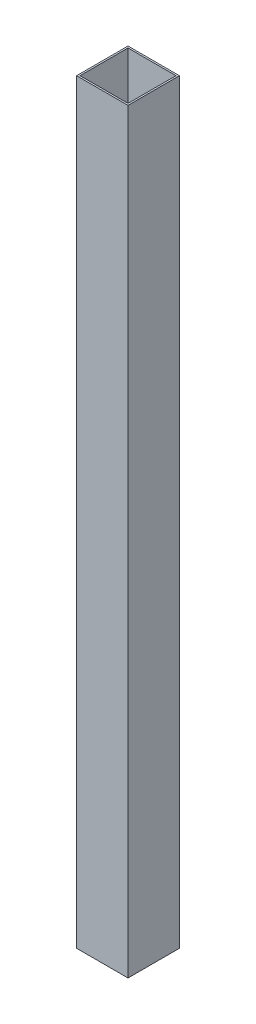
ISO-10303-21;
HEADER;
FILE_DESCRIPTION(('STEP AP214'),'2;1');
FILE_NAME('part.step','',(''),(''),'','','');
FILE_SCHEMA(('AUTOMOTIVE_DESIGN { 1 0 10303 214 1 1 1 1 }'));
ENDSEC;
DATA;
#1=APPLICATION_CONTEXT('core data for automotive mechanical design processes');
#2=APPLICATION_PROTOCOL_DEFINITION('international standard','automotive_design',2000,#1);
#3=PRODUCT_CONTEXT('',#1,'mechanical');
#4=PRODUCT('Part','Part','',(#3));
#5=PRODUCT_RELATED_PRODUCT_CATEGORY('part','',(#4));
#6=PRODUCT_DEFINITION_FORMATION('','',#4);
#7=PRODUCT_DEFINITION_CONTEXT('part definition',#1,'design');
#8=PRODUCT_DEFINITION('design','',#6,#7);
#9=PRODUCT_DEFINITION_SHAPE('','',#8);
#10=(LENGTH_UNIT() NAMED_UNIT(*) SI_UNIT(.MILLI.,.METRE.));
#11=(NAMED_UNIT(*) PLANE_ANGLE_UNIT() SI_UNIT($,.RADIAN.));
#12=(NAMED_UNIT(*) SI_UNIT($,.STERADIAN.) SOLID_ANGLE_UNIT());
#13=UNCERTAINTY_MEASURE_WITH_UNIT(LENGTH_MEASURE(1.E-05),#10,'distance_accuracy_value','');
#14=(GEOMETRIC_REPRESENTATION_CONTEXT(3) GLOBAL_UNCERTAINTY_ASSIGNED_CONTEXT((#13)) GLOBAL_UNIT_ASSIGNED_CONTEXT((#10,
#11,#12)) REPRESENTATION_CONTEXT('',''));
#15=CARTESIAN_POINT('',(0.,0.,0.));
#16=DIRECTION('',(0.,0.,1.));
#17=DIRECTION('',(1.,0.,0.));
#18=AXIS2_PLACEMENT_3D('',#15,#16,#17);
#19=CARTESIAN_POINT('',(-1002.,500.000000000001,440.));
#20=DIRECTION('',(1.,0.,0.));
#21=DIRECTION('',(0.,0.,-1.));
#22=AXIS2_PLACEMENT_3D('',#19,#20,#21);
#23=PLANE('',#22);
#24=DIRECTION('',(0.,-1.,0.));
#25=VECTOR('',#24,1.);
#26=CARTESIAN_POINT('',(-1002.,500.000000000001,500.));
#27=LINE('',#26,#25);
#28=CARTESIAN_POINT('',(-1002.,440.000000000001,500.));
#29=VERTEX_POINT('',#28);
#30=CARTESIAN_POINT('',(-1002.,-441.999999999999,500.));
#31=VERTEX_POINT('',#30);
#32=EDGE_CURVE('E162',#29,#31,#27,.T.);
#33=ORIENTED_EDGE('',*,*,#32,.F.);
#34=DIRECTION('',(0.,0.,-1.));
#35=VECTOR('',#34,1.);
#36=CARTESIAN_POINT('',(-1002.,440.000000000001,440.));
#37=LINE('',#36,#35);
#38=CARTESIAN_POINT('',(-1002.,440.000000000001,440.));
#39=VERTEX_POINT('',#38);
#40=EDGE_CURVE('E111',#29,#39,#37,.T.);
#41=ORIENTED_EDGE('',*,*,#40,.T.);
#42=DIRECTION('',(0.,-1.,0.));
#43=VECTOR('',#42,1.);
#44=CARTESIAN_POINT('',(-1002.,500.000000000001,440.));
#45=LINE('',#44,#43);
#46=CARTESIAN_POINT('',(-1002.,-441.999999999999,440.));
#47=VERTEX_POINT('',#46);
#48=EDGE_CURVE('E37',#39,#47,#45,.T.);
#49=ORIENTED_EDGE('',*,*,#48,.T.);
#50=DIRECTION('',(0.,0.,1.));
#51=VECTOR('',#50,1.);
#52=CARTESIAN_POINT('',(-1002.,-441.999999999999,440.));
#53=LINE('',#52,#51);
#54=EDGE_CURVE('E171',#47,#31,#53,.T.);
#55=ORIENTED_EDGE('',*,*,#54,.T.);
#56=EDGE_LOOP('',(#33,#41,#49,#55));
#57=FACE_BOUND('',#56,.T.);
#58=ADVANCED_FACE('F19',(#57),#23,.F.);
#59=CARTESIAN_POINT('',(-941.999999999999,500.000000000001,500.));
#60=DIRECTION('',(0.,0.,-1.));
#61=DIRECTION('',(-1.,0.,0.));
#62=AXIS2_PLACEMENT_3D('',#59,#60,#61);
#63=PLANE('',#62);
#64=DIRECTION('',(0.,-1.,0.));
#65=VECTOR('',#64,1.);
#66=CARTESIAN_POINT('',(-941.999999999999,500.000000000001,500.));
#67=LINE('',#66,#65);
#68=CARTESIAN_POINT('',(-941.999999999999,440.000000000001,500.));
#69=VERTEX_POINT('',#68);
#70=CARTESIAN_POINT('',(-942.,-441.999999999999,500.));
#71=VERTEX_POINT('',#70);
#72=EDGE_CURVE('E91',#69,#71,#67,.T.);
#73=ORIENTED_EDGE('',*,*,#72,.F.);
#74=DIRECTION('',(-1.,0.,0.));
#75=VECTOR('',#74,1.);
#76=CARTESIAN_POINT('',(-941.999999999999,440.000000000001,500.));
#77=LINE('',#76,#75);
#78=EDGE_CURVE('E94',#69,#29,#77,.T.);
#79=ORIENTED_EDGE('',*,*,#78,.T.);
#80=ORIENTED_EDGE('',*,*,#32,.T.);
#81=DIRECTION('',(1.,0.,0.));
#82=VECTOR('',#81,1.);
#83=CARTESIAN_POINT('',(-942.,-441.999999999999,500.));
#84=LINE('',#83,#82);
#85=EDGE_CURVE('E96',#31,#71,#84,.T.);
#86=ORIENTED_EDGE('',*,*,#85,.T.);
#87=EDGE_LOOP('',(#73,#79,#80,#86));
#88=FACE_BOUND('',#87,.T.);
#89=ADVANCED_FACE('F93',(#88),#63,.F.);
#90=CARTESIAN_POINT('',(-941.999999999999,500.000000000001,440.000000000001));
#91=DIRECTION('',(-1.,0.,0.));
#92=DIRECTION('',(0.,0.,1.));
#93=AXIS2_PLACEMENT_3D('',#90,#91,#92);
#94=PLANE('',#93);
#95=DIRECTION('',(0.,-1.,0.));
#96=VECTOR('',#95,1.);
#97=CARTESIAN_POINT('',(-941.999999999999,500.000000000001,440.000000000001));
#98=LINE('',#97,#96);
#99=CARTESIAN_POINT('',(-941.999999999999,440.000000000001,440.000000000002));
#100=VERTEX_POINT('',#99);
#101=CARTESIAN_POINT('',(-941.999999999998,-441.999999999999,440.));
#102=VERTEX_POINT('',#101);
#103=EDGE_CURVE('E115',#100,#102,#98,.T.);
#104=ORIENTED_EDGE('',*,*,#103,.F.);
#105=DIRECTION('',(0.,0.,1.));
#106=VECTOR('',#105,1.);
#107=CARTESIAN_POINT('',(-941.999999999999,440.000000000001,440.000000000002));
#108=LINE('',#107,#106);
#109=EDGE_CURVE('E109',#100,#69,#108,.T.);
#110=ORIENTED_EDGE('',*,*,#109,.T.);
#111=ORIENTED_EDGE('',*,*,#72,.T.);
#112=DIRECTION('',(0.,0.,-1.));
#113=VECTOR('',#112,1.);
#114=CARTESIAN_POINT('',(-941.999999999998,-441.999999999999,440.));
#115=LINE('',#114,#113);
#116=EDGE_CURVE('E102',#71,#102,#115,.T.);
#117=ORIENTED_EDGE('',*,*,#116,.T.);
#118=EDGE_LOOP('',(#104,#110,#111,#117));
#119=FACE_BOUND('',#118,.T.);
#120=ADVANCED_FACE('F114',(#119),#94,.F.);
#121=CARTESIAN_POINT('',(-941.999999999999,500.000000000001,440.000000000001));
#122=DIRECTION('',(0.,0.,1.));
#123=DIRECTION('',(1.,0.,0.));
#124=AXIS2_PLACEMENT_3D('',#121,#122,#123);
#125=PLANE('',#124);
#126=ORIENTED_EDGE('',*,*,#48,.F.);
#127=DIRECTION('',(1.,0.,0.));
#128=VECTOR('',#127,1.);
#129=CARTESIAN_POINT('',(-941.999999999999,440.000000000001,440.000000000002));
#130=LINE('',#129,#128);
#131=EDGE_CURVE('E117',#39,#100,#130,.T.);
#132=ORIENTED_EDGE('',*,*,#131,.T.);
#133=ORIENTED_EDGE('',*,*,#103,.T.);
#134=DIRECTION('',(-1.,0.,0.));
#135=VECTOR('',#134,1.);
#136=CARTESIAN_POINT('',(-941.999999999998,-441.999999999999,440.));
#137=LINE('',#136,#135);
#138=EDGE_CURVE('E158',#102,#47,#137,.T.);
#139=ORIENTED_EDGE('',*,*,#138,.T.);
#140=EDGE_LOOP('',(#126,#132,#133,#139));
#141=FACE_BOUND('',#140,.T.);
#142=ADVANCED_FACE('F210',(#141),#125,.F.);
#143=CARTESIAN_POINT('',(-999.999999999999,500.000000000001,442.));
#144=DIRECTION('',(1.,0.,0.));
#145=DIRECTION('',(0.,0.,-1.));
#146=AXIS2_PLACEMENT_3D('',#143,#144,#145);
#147=PLANE('',#146);
#148=DIRECTION('',(0.,-1.,0.));
#149=VECTOR('',#148,1.);
#150=CARTESIAN_POINT('',(-999.999999999999,500.000000000001,442.));
#151=LINE('',#150,#149);
#152=CARTESIAN_POINT('',(-999.999999999999,440.000000000001,442.));
#153=VERTEX_POINT('',#152);
#154=CARTESIAN_POINT('',(-1000.,-441.999999999999,442.));
#155=VERTEX_POINT('',#154);
#156=EDGE_CURVE('E202',#153,#155,#151,.T.);
#157=ORIENTED_EDGE('',*,*,#156,.F.);
#158=DIRECTION('',(0.,0.,-1.));
#159=VECTOR('',#158,1.);
#160=CARTESIAN_POINT('',(-999.999999999999,440.000000000001,442.));
#161=LINE('',#160,#159);
#162=CARTESIAN_POINT('',(-999.999999999999,440.000000000001,498.));
#163=VERTEX_POINT('',#162);
#164=EDGE_CURVE('E126',#163,#153,#161,.T.);
#165=ORIENTED_EDGE('',*,*,#164,.F.);
#166=DIRECTION('',(0.,-1.,0.));
#167=VECTOR('',#166,1.);
#168=CARTESIAN_POINT('',(-999.999999999999,500.000000000001,498.));
#169=LINE('',#168,#167);
#170=CARTESIAN_POINT('',(-1000.,-441.999999999999,498.));
#171=VERTEX_POINT('',#170);
#172=EDGE_CURVE('E159',#163,#171,#169,.T.);
#173=ORIENTED_EDGE('',*,*,#172,.T.);
#174=DIRECTION('',(0.,0.,1.));
#175=VECTOR('',#174,1.);
#176=CARTESIAN_POINT('',(-1000.,-441.999999999999,442.));
#177=LINE('',#176,#175);
#178=EDGE_CURVE('E143',#155,#171,#177,.T.);
#179=ORIENTED_EDGE('',*,*,#178,.F.);
#180=EDGE_LOOP('',(#157,#165,#173,#179));
#181=FACE_BOUND('',#180,.T.);
#182=ADVANCED_FACE('F208',(#181),#147,.T.);
#183=CARTESIAN_POINT('',(-943.999999999999,500.000000000001,442.));
#184=DIRECTION('',(0.,0.,1.));
#185=DIRECTION('',(1.,0.,0.));
#186=AXIS2_PLACEMENT_3D('',#183,#184,#185);
#187=PLANE('',#186);
#188=DIRECTION('',(0.,-1.,0.));
#189=VECTOR('',#188,1.);
#190=CARTESIAN_POINT('',(-943.999999999999,500.000000000001,442.));
#191=LINE('',#190,#189);
#192=CARTESIAN_POINT('',(-943.999999999999,440.000000000001,442.));
#193=VERTEX_POINT('',#192);
#194=CARTESIAN_POINT('',(-944.,-441.999999999999,442.));
#195=VERTEX_POINT('',#194);
#196=EDGE_CURVE('E148',#193,#195,#191,.T.);
#197=ORIENTED_EDGE('',*,*,#196,.F.);
#198=DIRECTION('',(1.,0.,0.));
#199=VECTOR('',#198,1.);
#200=CARTESIAN_POINT('',(-943.999999999999,440.000000000001,442.));
#201=LINE('',#200,#199);
#202=EDGE_CURVE('E130',#153,#193,#201,.T.);
#203=ORIENTED_EDGE('',*,*,#202,.F.);
#204=ORIENTED_EDGE('',*,*,#156,.T.);
#205=DIRECTION('',(-1.,0.,0.));
#206=VECTOR('',#205,1.);
#207=CARTESIAN_POINT('',(-944.,-441.999999999999,442.));
#208=LINE('',#207,#206);
#209=EDGE_CURVE('E12',#195,#155,#208,.T.);
#210=ORIENTED_EDGE('',*,*,#209,.F.);
#211=EDGE_LOOP('',(#197,#203,#204,#210));
#212=FACE_BOUND('',#211,.T.);
#213=ADVANCED_FACE('F201',(#212),#187,.T.);
#214=CARTESIAN_POINT('',(-943.999999999999,500.000000000001,442.));
#215=DIRECTION('',(-1.,0.,0.));
#216=DIRECTION('',(0.,0.,1.));
#217=AXIS2_PLACEMENT_3D('',#214,#215,#216);
#218=PLANE('',#217);
#219=DIRECTION('',(0.,-1.,0.));
#220=VECTOR('',#219,1.);
#221=CARTESIAN_POINT('',(-943.999999999999,500.000000000001,498.));
#222=LINE('',#221,#220);
#223=CARTESIAN_POINT('',(-943.999999999999,440.000000000001,498.000000000002));
#224=VERTEX_POINT('',#223);
#225=CARTESIAN_POINT('',(-944.,-441.999999999999,498.));
#226=VERTEX_POINT('',#225);
#227=EDGE_CURVE('E144',#224,#226,#222,.T.);
#228=ORIENTED_EDGE('',*,*,#227,.F.);
#229=DIRECTION('',(0.,0.,1.));
#230=VECTOR('',#229,1.);
#231=CARTESIAN_POINT('',(-943.999999999999,440.000000000001,442.));
#232=LINE('',#231,#230);
#233=EDGE_CURVE('E134',#193,#224,#232,.T.);
#234=ORIENTED_EDGE('',*,*,#233,.F.);
#235=ORIENTED_EDGE('',*,*,#196,.T.);
#236=DIRECTION('',(0.,0.,-1.));
#237=VECTOR('',#236,1.);
#238=CARTESIAN_POINT('',(-944.,-441.999999999999,442.));
#239=LINE('',#238,#237);
#240=EDGE_CURVE('E24',#226,#195,#239,.T.);
#241=ORIENTED_EDGE('',*,*,#240,.F.);
#242=EDGE_LOOP('',(#228,#234,#235,#241));
#243=FACE_BOUND('',#242,.T.);
#244=ADVANCED_FACE('F196',(#243),#218,.T.);
#245=CARTESIAN_POINT('',(-943.999999999999,500.000000000001,498.));
#246=DIRECTION('',(0.,0.,-1.));
#247=DIRECTION('',(-1.,0.,0.));
#248=AXIS2_PLACEMENT_3D('',#245,#246,#247);
#249=PLANE('',#248);
#250=ORIENTED_EDGE('',*,*,#172,.F.);
#251=DIRECTION('',(-1.,0.,0.));
#252=VECTOR('',#251,1.);
#253=CARTESIAN_POINT('',(-943.999999999999,440.000000000001,498.000000000002));
#254=LINE('',#253,#252);
#255=EDGE_CURVE('E138',#224,#163,#254,.T.);
#256=ORIENTED_EDGE('',*,*,#255,.F.);
#257=ORIENTED_EDGE('',*,*,#227,.T.);
#258=DIRECTION('',(1.,0.,0.));
#259=VECTOR('',#258,1.);
#260=CARTESIAN_POINT('',(-944.,-441.999999999999,498.));
#261=LINE('',#260,#259);
#262=EDGE_CURVE('E139',#171,#226,#261,.T.);
#263=ORIENTED_EDGE('',*,*,#262,.F.);
#264=EDGE_LOOP('',(#250,#256,#257,#263));
#265=FACE_BOUND('',#264,.T.);
#266=ADVANCED_FACE('F191',(#265),#249,.T.);
#267=CARTESIAN_POINT('',(-973.999999999998,-442.,250.));
#268=DIRECTION('',(0.,1.,0.));
#269=DIRECTION('',(0.,0.,1.));
#270=AXIS2_PLACEMENT_3D('',#267,#268,#269);
#271=PLANE('',#270);
#272=ORIENTED_EDGE('',*,*,#178,.T.);
#273=ORIENTED_EDGE('',*,*,#262,.T.);
#274=ORIENTED_EDGE('',*,*,#240,.T.);
#275=ORIENTED_EDGE('',*,*,#209,.T.);
#276=EDGE_LOOP('',(#272,#273,#274,#275));
#277=FACE_BOUND('',#276,.T.);
#278=ORIENTED_EDGE('',*,*,#138,.F.);
#279=ORIENTED_EDGE('',*,*,#116,.F.);
#280=ORIENTED_EDGE('',*,*,#85,.F.);
#281=ORIENTED_EDGE('',*,*,#54,.F.);
#282=EDGE_LOOP('',(#278,#279,#280,#281));
#283=FACE_BOUND('',#282,.T.);
#284=ADVANCED_FACE('F22',(#277,#283),#271,.F.);
#285=CARTESIAN_POINT('',(-971.999999999999,440.,250.));
#286=DIRECTION('',(0.,-1.,0.));
#287=DIRECTION('',(0.,0.,-1.));
#288=AXIS2_PLACEMENT_3D('',#285,#286,#287);
#289=PLANE('',#288);
#290=ORIENTED_EDGE('',*,*,#164,.T.);
#291=ORIENTED_EDGE('',*,*,#202,.T.);
#292=ORIENTED_EDGE('',*,*,#233,.T.);
#293=ORIENTED_EDGE('',*,*,#255,.T.);
#294=EDGE_LOOP('',(#290,#291,#292,#293));
#295=FACE_BOUND('',#294,.T.);
#296=ORIENTED_EDGE('',*,*,#78,.F.);
#297=ORIENTED_EDGE('',*,*,#109,.F.);
#298=ORIENTED_EDGE('',*,*,#131,.F.);
#299=ORIENTED_EDGE('',*,*,#40,.F.);
#300=EDGE_LOOP('',(#296,#297,#298,#299));
#301=FACE_BOUND('',#300,.T.);
#302=ADVANCED_FACE('F107',(#295,#301),#289,.F.);
#303=CLOSED_SHELL('',(#58,#89,#120,#142,#182,#213,#244,#266,#284,#302));
#304=MANIFOLD_SOLID_BREP('B1',#303);
#305=ADVANCED_BREP_SHAPE_REPRESENTATION('',(#18,#304),#14);
#306=SHAPE_DEFINITION_REPRESENTATION(#9,#305);
ENDSEC;
END-ISO-10303-21;
